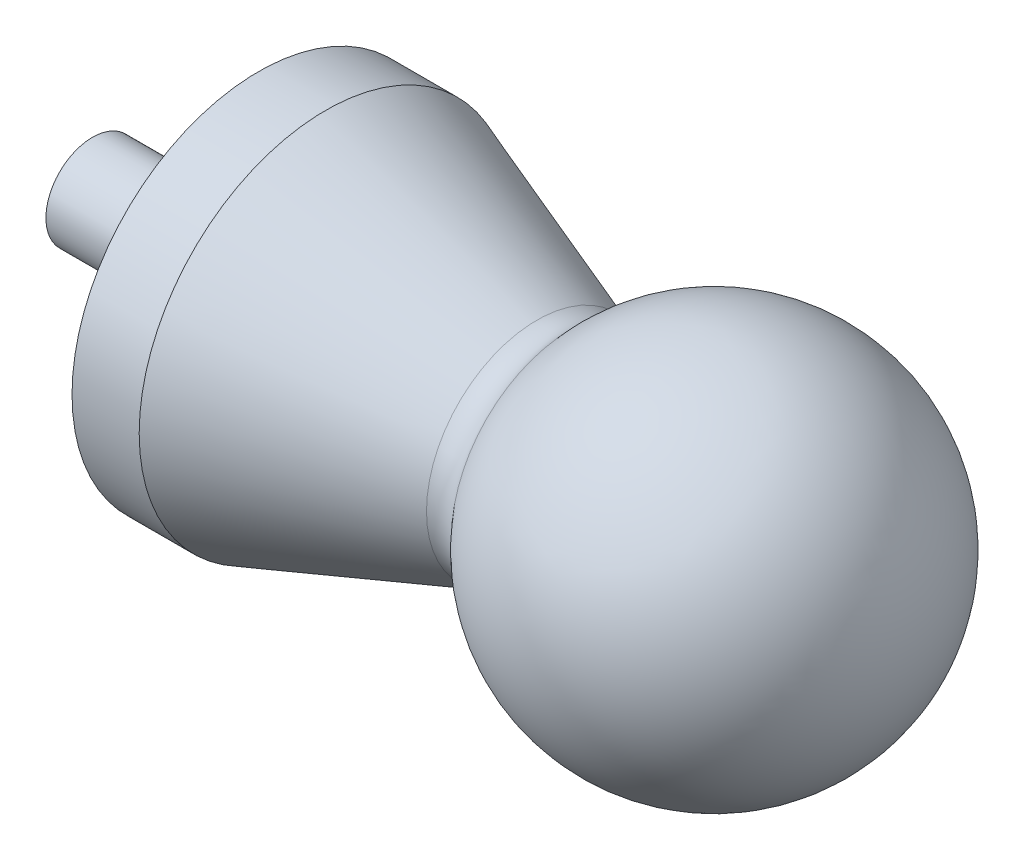
ISO-10303-21;
HEADER;
FILE_DESCRIPTION(('STEP AP214'),'2;1');
FILE_NAME('part.step','',(''),(''),'','','');
FILE_SCHEMA(('AUTOMOTIVE_DESIGN { 1 0 10303 214 1 1 1 1 }'));
ENDSEC;
DATA;
#1=APPLICATION_CONTEXT('core data for automotive mechanical design processes');
#2=APPLICATION_PROTOCOL_DEFINITION('international standard','automotive_design',2000,#1);
#3=PRODUCT_CONTEXT('',#1,'mechanical');
#4=PRODUCT('Part','Part','',(#3));
#5=PRODUCT_RELATED_PRODUCT_CATEGORY('part','',(#4));
#6=PRODUCT_DEFINITION_FORMATION('','',#4);
#7=PRODUCT_DEFINITION_CONTEXT('part definition',#1,'design');
#8=PRODUCT_DEFINITION('design','',#6,#7);
#9=PRODUCT_DEFINITION_SHAPE('','',#8);
#10=(LENGTH_UNIT() NAMED_UNIT(*) SI_UNIT(.MILLI.,.METRE.));
#11=(NAMED_UNIT(*) PLANE_ANGLE_UNIT() SI_UNIT($,.RADIAN.));
#12=(NAMED_UNIT(*) SI_UNIT($,.STERADIAN.) SOLID_ANGLE_UNIT());
#13=UNCERTAINTY_MEASURE_WITH_UNIT(LENGTH_MEASURE(1.E-05),#10,'distance_accuracy_value','');
#14=(GEOMETRIC_REPRESENTATION_CONTEXT(3) GLOBAL_UNCERTAINTY_ASSIGNED_CONTEXT((#13)) GLOBAL_UNIT_ASSIGNED_CONTEXT((#10,
#11,#12)) REPRESENTATION_CONTEXT('',''));
#15=CARTESIAN_POINT('',(0.,0.,0.));
#16=DIRECTION('',(0.,0.,1.));
#17=DIRECTION('',(1.,0.,0.));
#18=AXIS2_PLACEMENT_3D('',#15,#16,#17);
#19=CARTESIAN_POINT('',(25.0028109522093,0.,0.));
#20=DIRECTION('',(1.,0.,0.));
#21=DIRECTION('',(0.,0.,-1.));
#22=AXIS2_PLACEMENT_3D('',#19,#20,#21);
#23=CYLINDRICAL_SURFACE('',#22,3.00000000000001);
#24=CARTESIAN_POINT('',(-40.,0.,0.));
#25=DIRECTION('',(1.,0.,0.));
#26=DIRECTION('',(0.,0.,-1.));
#27=AXIS2_PLACEMENT_3D('',#24,#25,#26);
#28=CIRCLE('',#27,3.00000000000001);
#29=CARTESIAN_POINT('',(-40.,0.,-3.00000000000001));
#30=VERTEX_POINT('',#29);
#31=EDGE_CURVE('E53',#30,#30,#28,.T.);
#32=ORIENTED_EDGE('',*,*,#31,.T.);
#33=EDGE_LOOP('',(#32));
#34=FACE_BOUND('',#33,.T.);
#35=CARTESIAN_POINT('',(-29.32,0.,0.));
#36=DIRECTION('',(1.,0.,0.));
#37=DIRECTION('',(0.,0.,-1.));
#38=AXIS2_PLACEMENT_3D('',#35,#36,#37);
#39=CIRCLE('',#38,3.00000000000001);
#40=CARTESIAN_POINT('',(-29.32,0.,-3.00000000000001));
#41=VERTEX_POINT('',#40);
#42=EDGE_CURVE('E69',#41,#41,#39,.T.);
#43=ORIENTED_EDGE('',*,*,#42,.F.);
#44=EDGE_LOOP('',(#43));
#45=FACE_BOUND('',#44,.T.);
#46=ADVANCED_FACE('F41',(#34,#45),#23,.T.);
#47=CARTESIAN_POINT('',(-40.,0.,0.));
#48=DIRECTION('',(-1.,0.,0.));
#49=DIRECTION('',(0.,0.,1.));
#50=AXIS2_PLACEMENT_3D('',#47,#48,#49);
#51=PLANE('',#50);
#52=ORIENTED_EDGE('',*,*,#31,.F.);
#53=EDGE_LOOP('',(#52));
#54=FACE_BOUND('',#53,.T.);
#55=ADVANCED_FACE('F81',(#54),#51,.T.);
#56=CARTESIAN_POINT('',(0.,0.,0.));
#57=DIRECTION('',(1.,0.,0.));
#58=DIRECTION('',(0.,0.,1.));
#59=AXIS2_PLACEMENT_3D('',#56,#57,#58);
#60=SPHERICAL_SURFACE('',#59,12.);
#61=CARTESIAN_POINT('',(-9.19943848116923,0.,0.));
#62=DIRECTION('',(1.,0.,0.));
#63=DIRECTION('',(0.,0.,-1.));
#64=AXIS2_PLACEMENT_3D('',#61,#62,#63);
#65=CIRCLE('',#64,7.70521457398707);
#66=CARTESIAN_POINT('',(-9.19943848116923,0.,-7.70521457398707));
#67=VERTEX_POINT('',#66);
#68=EDGE_CURVE('E48',#67,#67,#65,.T.);
#69=ORIENTED_EDGE('',*,*,#68,.T.);
#70=EDGE_LOOP('',(#69));
#71=FACE_BOUND('',#70,.T.);
#72=ADVANCED_FACE('F86',(#71),#60,.T.);
#73=CARTESIAN_POINT('',(-10.0177619435316,0.,0.));
#74=DIRECTION('',(-1.,0.,0.));
#75=DIRECTION('',(0.,0.,1.));
#76=AXIS2_PLACEMENT_3D('',#73,#74,#75);
#77=CONICAL_SURFACE('',#76,6.60639429967138,0.345555580581711);
#78=CARTESIAN_POINT('',(-11.4101171645763,0.,0.));
#79=DIRECTION('',(-1.,0.,0.));
#80=DIRECTION('',(0.,0.,1.));
#81=AXIS2_PLACEMENT_3D('',#78,#79,#80);
#82=CIRCLE('',#81,7.10764217924746);
#83=CARTESIAN_POINT('',(-11.4101171645763,0.,7.10764217924746));
#84=VERTEX_POINT('',#83);
#85=EDGE_CURVE('E10',#84,#84,#82,.T.);
#86=ORIENTED_EDGE('',*,*,#85,.T.);
#87=EDGE_LOOP('',(#86));
#88=FACE_BOUND('',#87,.T.);
#89=CARTESIAN_POINT('',(-25.,0.,0.));
#90=DIRECTION('',(1.,0.,0.));
#91=DIRECTION('',(0.,0.,-1.));
#92=AXIS2_PLACEMENT_3D('',#89,#90,#91);
#93=CIRCLE('',#92,12.);
#94=CARTESIAN_POINT('',(-25.,0.,-12.));
#95=VERTEX_POINT('',#94);
#96=EDGE_CURVE('E60',#95,#95,#93,.T.);
#97=ORIENTED_EDGE('',*,*,#96,.T.);
#98=EDGE_LOOP('',(#97));
#99=FACE_BOUND('',#98,.T.);
#100=ADVANCED_FACE('F92',(#88,#99),#77,.T.);
#101=CARTESIAN_POINT('',(25.0028109522093,0.,0.));
#102=DIRECTION('',(1.,0.,0.));
#103=DIRECTION('',(0.,0.,-1.));
#104=AXIS2_PLACEMENT_3D('',#101,#102,#103);
#105=CYLINDRICAL_SURFACE('',#104,12.);
#106=CARTESIAN_POINT('',(-29.32,0.,0.));
#107=DIRECTION('',(1.,0.,0.));
#108=DIRECTION('',(0.,0.,-1.));
#109=AXIS2_PLACEMENT_3D('',#106,#107,#108);
#110=CIRCLE('',#109,12.);
#111=CARTESIAN_POINT('',(-29.32,0.,-12.));
#112=VERTEX_POINT('',#111);
#113=EDGE_CURVE('E65',#112,#112,#110,.T.);
#114=ORIENTED_EDGE('',*,*,#113,.T.);
#115=EDGE_LOOP('',(#114));
#116=FACE_BOUND('',#115,.T.);
#117=ORIENTED_EDGE('',*,*,#96,.F.);
#118=EDGE_LOOP('',(#117));
#119=FACE_BOUND('',#118,.T.);
#120=ADVANCED_FACE('F94',(#116,#119),#105,.T.);
#121=CARTESIAN_POINT('',(-29.32,0.,-3.00000000000001));
#122=DIRECTION('',(-1.,0.,0.));
#123=DIRECTION('',(0.,0.,1.));
#124=AXIS2_PLACEMENT_3D('',#121,#122,#123);
#125=PLANE('',#124);
#126=ORIENTED_EDGE('',*,*,#42,.T.);
#127=EDGE_LOOP('',(#126));
#128=FACE_BOUND('',#127,.T.);
#129=ORIENTED_EDGE('',*,*,#113,.F.);
#130=EDGE_LOOP('',(#129));
#131=FACE_BOUND('',#130,.T.);
#132=ADVANCED_FACE('F77',(#128,#131),#125,.T.);
#133=CARTESIAN_POINT('',(-10.7326782280308,0.,0.));
#134=DIRECTION('',(1.,0.,0.));
#135=DIRECTION('',(0.,0.,-1.));
#136=AXIS2_PLACEMENT_3D('',#133,#134,#135);
#137=TOROIDAL_SURFACE('',#136,8.98941700298491,2.);
#138=ORIENTED_EDGE('',*,*,#85,.F.);
#139=EDGE_LOOP('',(#138));
#140=FACE_BOUND('',#139,.T.);
#141=ORIENTED_EDGE('',*,*,#68,.F.);
#142=EDGE_LOOP('',(#141));
#143=FACE_BOUND('',#142,.T.);
#144=ADVANCED_FACE('F43',(#140,#143),#137,.F.);
#145=CLOSED_SHELL('',(#46,#55,#72,#100,#120,#132,#144));
#146=MANIFOLD_SOLID_BREP('B2',#145);
#147=ADVANCED_BREP_SHAPE_REPRESENTATION('',(#18,#146),#14);
#148=SHAPE_DEFINITION_REPRESENTATION(#9,#147);
ENDSEC;
END-ISO-10303-21;
